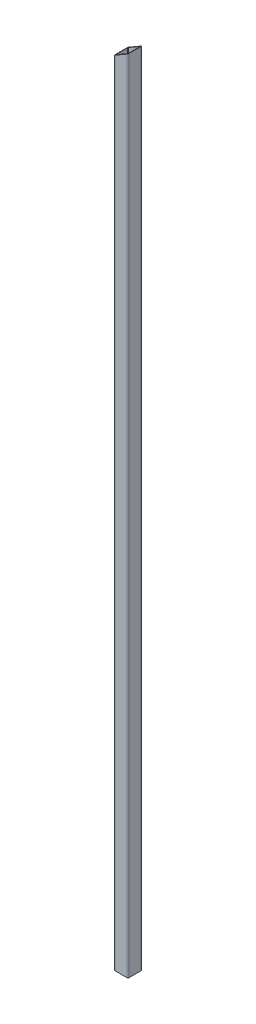
ISO-10303-21;
HEADER;
FILE_DESCRIPTION(('STEP AP214'),'2;1');
FILE_NAME('part.step','',(''),(''),'','','');
FILE_SCHEMA(('AUTOMOTIVE_DESIGN { 1 0 10303 214 1 1 1 1 }'));
ENDSEC;
DATA;
#1=APPLICATION_CONTEXT('core data for automotive mechanical design processes');
#2=APPLICATION_PROTOCOL_DEFINITION('international standard','automotive_design',2000,#1);
#3=PRODUCT_CONTEXT('',#1,'mechanical');
#4=PRODUCT('Part','Part','',(#3));
#5=PRODUCT_RELATED_PRODUCT_CATEGORY('part','',(#4));
#6=PRODUCT_DEFINITION_FORMATION('','',#4);
#7=PRODUCT_DEFINITION_CONTEXT('part definition',#1,'design');
#8=PRODUCT_DEFINITION('design','',#6,#7);
#9=PRODUCT_DEFINITION_SHAPE('','',#8);
#10=(LENGTH_UNIT() NAMED_UNIT(*) SI_UNIT(.MILLI.,.METRE.));
#11=(NAMED_UNIT(*) PLANE_ANGLE_UNIT() SI_UNIT($,.RADIAN.));
#12=(NAMED_UNIT(*) SI_UNIT($,.STERADIAN.) SOLID_ANGLE_UNIT());
#13=UNCERTAINTY_MEASURE_WITH_UNIT(LENGTH_MEASURE(1.E-05),#10,'distance_accuracy_value','');
#14=(GEOMETRIC_REPRESENTATION_CONTEXT(3) GLOBAL_UNCERTAINTY_ASSIGNED_CONTEXT((#13)) GLOBAL_UNIT_ASSIGNED_CONTEXT((#10,
#11,#12)) REPRESENTATION_CONTEXT('',''));
#15=CARTESIAN_POINT('',(0.,0.,0.));
#16=DIRECTION('',(0.,0.,1.));
#17=DIRECTION('',(1.,0.,0.));
#18=AXIS2_PLACEMENT_3D('',#15,#16,#17);
#19=CARTESIAN_POINT('',(-22.,-150.,22.));
#20=DIRECTION('',(0.,1.,0.));
#21=DIRECTION('',(0.,0.,1.));
#22=AXIS2_PLACEMENT_3D('',#19,#20,#21);
#23=CYLINDRICAL_SURFACE('',#22,3.);
#24=DIRECTION('',(0.,1.,0.));
#25=VECTOR('',#24,1.);
#26=CARTESIAN_POINT('',(-22.,-150.,25.));
#27=LINE('',#26,#25);
#28=CARTESIAN_POINT('',(-22.,-150.,25.));
#29=VERTEX_POINT('',#28);
#30=CARTESIAN_POINT('',(-22.,2678.15709287832,25.));
#31=VERTEX_POINT('',#30);
#32=EDGE_CURVE('E38',#29,#31,#27,.T.);
#33=ORIENTED_EDGE('',*,*,#32,.T.);
#34=CARTESIAN_POINT('',(-22.,2678.15709287832,22.));
#35=DIRECTION('',(0.5,-0.866025403784439,0.));
#36=DIRECTION('',(-0.866025403784439,-0.5,0.));
#37=AXIS2_PLACEMENT_3D('',#34,#35,#36);
#38=ELLIPSE('',#37,3.46410161513776,3.);
#39=CARTESIAN_POINT('',(-25.,2676.42504207075,22.));
#40=VERTEX_POINT('',#39);
#41=EDGE_CURVE('E167',#31,#40,#38,.T.);
#42=ORIENTED_EDGE('',*,*,#41,.T.);
#43=DIRECTION('',(0.,1.,0.));
#44=VECTOR('',#43,1.);
#45=CARTESIAN_POINT('',(-25.,-150.,22.));
#46=LINE('',#45,#44);
#47=CARTESIAN_POINT('',(-25.,-150.,22.));
#48=VERTEX_POINT('',#47);
#49=EDGE_CURVE('E11',#48,#40,#46,.T.);
#50=ORIENTED_EDGE('',*,*,#49,.F.);
#51=CARTESIAN_POINT('',(-22.,-150.,22.));
#52=DIRECTION('',(0.,1.,0.));
#53=DIRECTION('',(0.,0.,1.));
#54=AXIS2_PLACEMENT_3D('',#51,#52,#53);
#55=CIRCLE('',#54,3.);
#56=EDGE_CURVE('E234',#48,#29,#55,.T.);
#57=ORIENTED_EDGE('',*,*,#56,.T.);
#58=EDGE_LOOP('',(#33,#42,#50,#57));
#59=FACE_BOUND('',#58,.T.);
#60=ADVANCED_FACE('F35',(#59),#23,.T.);
#61=CARTESIAN_POINT('',(-25.,-150.,-22.));
#62=DIRECTION('',(-1.,0.,0.));
#63=DIRECTION('',(0.,0.,1.));
#64=AXIS2_PLACEMENT_3D('',#61,#62,#63);
#65=PLANE('',#64);
#66=ORIENTED_EDGE('',*,*,#49,.T.);
#67=DIRECTION('',(0.,0.,-1.));
#68=VECTOR('',#67,1.);
#69=CARTESIAN_POINT('',(-25.,2676.42504207075,-22.));
#70=LINE('',#69,#68);
#71=CARTESIAN_POINT('',(-25.,2676.42504207075,-22.));
#72=VERTEX_POINT('',#71);
#73=EDGE_CURVE('E184',#40,#72,#70,.T.);
#74=ORIENTED_EDGE('',*,*,#73,.T.);
#75=DIRECTION('',(0.,1.,0.));
#76=VECTOR('',#75,1.);
#77=CARTESIAN_POINT('',(-25.,-150.,-22.));
#78=LINE('',#77,#76);
#79=CARTESIAN_POINT('',(-25.,-150.,-22.));
#80=VERTEX_POINT('',#79);
#81=EDGE_CURVE('E43',#80,#72,#78,.T.);
#82=ORIENTED_EDGE('',*,*,#81,.F.);
#83=DIRECTION('',(0.,0.,1.));
#84=VECTOR('',#83,1.);
#85=CARTESIAN_POINT('',(-25.,-150.,-22.));
#86=LINE('',#85,#84);
#87=EDGE_CURVE('E264',#80,#48,#86,.T.);
#88=ORIENTED_EDGE('',*,*,#87,.T.);
#89=EDGE_LOOP('',(#66,#74,#82,#88));
#90=FACE_BOUND('',#89,.T.);
#91=ADVANCED_FACE('F293',(#90),#65,.T.);
#92=CARTESIAN_POINT('',(-22.,-150.,-22.));
#93=DIRECTION('',(0.,1.,0.));
#94=DIRECTION('',(0.,0.,1.));
#95=AXIS2_PLACEMENT_3D('',#92,#93,#94);
#96=CYLINDRICAL_SURFACE('',#95,3.);
#97=ORIENTED_EDGE('',*,*,#81,.T.);
#98=CARTESIAN_POINT('',(-22.,2678.15709287832,-22.));
#99=DIRECTION('',(0.5,-0.866025403784439,0.));
#100=DIRECTION('',(-0.866025403784439,-0.5,0.));
#101=AXIS2_PLACEMENT_3D('',#98,#99,#100);
#102=ELLIPSE('',#101,3.46410161513776,3.);
#103=CARTESIAN_POINT('',(-22.,2678.15709287832,-25.));
#104=VERTEX_POINT('',#103);
#105=EDGE_CURVE('E181',#72,#104,#102,.T.);
#106=ORIENTED_EDGE('',*,*,#105,.T.);
#107=DIRECTION('',(0.,1.,0.));
#108=VECTOR('',#107,1.);
#109=CARTESIAN_POINT('',(-22.,-150.,-25.));
#110=LINE('',#109,#108);
#111=CARTESIAN_POINT('',(-22.,-150.,-25.));
#112=VERTEX_POINT('',#111);
#113=EDGE_CURVE('E268',#112,#104,#110,.T.);
#114=ORIENTED_EDGE('',*,*,#113,.F.);
#115=CARTESIAN_POINT('',(-22.,-150.,-22.));
#116=DIRECTION('',(0.,1.,0.));
#117=DIRECTION('',(0.,0.,1.));
#118=AXIS2_PLACEMENT_3D('',#115,#116,#117);
#119=CIRCLE('',#118,3.);
#120=EDGE_CURVE('E261',#112,#80,#119,.T.);
#121=ORIENTED_EDGE('',*,*,#120,.T.);
#122=EDGE_LOOP('',(#97,#106,#114,#121));
#123=FACE_BOUND('',#122,.T.);
#124=ADVANCED_FACE('F290',(#123),#96,.T.);
#125=CARTESIAN_POINT('',(-22.,-150.,-25.));
#126=DIRECTION('',(0.,0.,-1.));
#127=DIRECTION('',(-1.,0.,0.));
#128=AXIS2_PLACEMENT_3D('',#125,#126,#127);
#129=PLANE('',#128);
#130=ORIENTED_EDGE('',*,*,#113,.T.);
#131=DIRECTION('',(0.866025403784439,0.5,0.));
#132=VECTOR('',#131,1.);
#133=CARTESIAN_POINT('',(16.4869804220583,2700.37756138529,-25.));
#134=LINE('',#133,#132);
#135=CARTESIAN_POINT('',(22.,2703.56050472266,-25.));
#136=VERTEX_POINT('',#135);
#137=EDGE_CURVE('E178',#104,#136,#134,.T.);
#138=ORIENTED_EDGE('',*,*,#137,.T.);
#139=DIRECTION('',(0.,1.,0.));
#140=VECTOR('',#139,1.);
#141=CARTESIAN_POINT('',(22.,-150.,-25.));
#142=LINE('',#141,#140);
#143=CARTESIAN_POINT('',(22.,-150.,-25.));
#144=VERTEX_POINT('',#143);
#145=EDGE_CURVE('E270',#144,#136,#142,.T.);
#146=ORIENTED_EDGE('',*,*,#145,.F.);
#147=DIRECTION('',(-1.,0.,0.));
#148=VECTOR('',#147,1.);
#149=CARTESIAN_POINT('',(-22.,-150.,-25.));
#150=LINE('',#149,#148);
#151=EDGE_CURVE('E258',#144,#112,#150,.T.);
#152=ORIENTED_EDGE('',*,*,#151,.T.);
#153=EDGE_LOOP('',(#130,#138,#146,#152));
#154=FACE_BOUND('',#153,.T.);
#155=ADVANCED_FACE('F284',(#154),#129,.T.);
#156=CARTESIAN_POINT('',(22.,-150.,-22.));
#157=DIRECTION('',(0.,1.,0.));
#158=DIRECTION('',(0.,0.,1.));
#159=AXIS2_PLACEMENT_3D('',#156,#157,#158);
#160=CYLINDRICAL_SURFACE('',#159,3.00000000000001);
#161=ORIENTED_EDGE('',*,*,#145,.T.);
#162=CARTESIAN_POINT('',(22.,2703.56050472266,-22.));
#163=DIRECTION('',(0.5,-0.866025403784439,0.));
#164=DIRECTION('',(-0.866025403784439,-0.5,0.));
#165=AXIS2_PLACEMENT_3D('',#162,#163,#164);
#166=ELLIPSE('',#165,3.46410161513776,3.00000000000001);
#167=CARTESIAN_POINT('',(25.,2705.29255553023,-22.));
#168=VERTEX_POINT('',#167);
#169=EDGE_CURVE('E172',#136,#168,#166,.T.);
#170=ORIENTED_EDGE('',*,*,#169,.T.);
#171=DIRECTION('',(0.,1.,0.));
#172=VECTOR('',#171,1.);
#173=CARTESIAN_POINT('',(25.,-150.,-22.));
#174=LINE('',#173,#172);
#175=CARTESIAN_POINT('',(25.,-150.,-22.));
#176=VERTEX_POINT('',#175);
#177=EDGE_CURVE('E272',#176,#168,#174,.T.);
#178=ORIENTED_EDGE('',*,*,#177,.F.);
#179=CARTESIAN_POINT('',(22.,-150.,-22.));
#180=DIRECTION('',(0.,1.,0.));
#181=DIRECTION('',(0.,0.,-1.));
#182=AXIS2_PLACEMENT_3D('',#179,#180,#181);
#183=CIRCLE('',#182,3.00000000000001);
#184=EDGE_CURVE('E255',#176,#144,#183,.T.);
#185=ORIENTED_EDGE('',*,*,#184,.T.);
#186=EDGE_LOOP('',(#161,#170,#178,#185));
#187=FACE_BOUND('',#186,.T.);
#188=ADVANCED_FACE('F281',(#187),#160,.T.);
#189=CARTESIAN_POINT('',(25.,-150.,-22.));
#190=DIRECTION('',(1.,0.,0.));
#191=DIRECTION('',(0.,0.,-1.));
#192=AXIS2_PLACEMENT_3D('',#189,#190,#191);
#193=PLANE('',#192);
#194=ORIENTED_EDGE('',*,*,#177,.T.);
#195=DIRECTION('',(0.,0.,1.));
#196=VECTOR('',#195,1.);
#197=CARTESIAN_POINT('',(25.,2705.29255553023,-22.));
#198=LINE('',#197,#196);
#199=CARTESIAN_POINT('',(25.,2705.29255553023,22.));
#200=VERTEX_POINT('',#199);
#201=EDGE_CURVE('E170',#168,#200,#198,.T.);
#202=ORIENTED_EDGE('',*,*,#201,.T.);
#203=DIRECTION('',(0.,1.,0.));
#204=VECTOR('',#203,1.);
#205=CARTESIAN_POINT('',(25.,-150.,22.));
#206=LINE('',#205,#204);
#207=CARTESIAN_POINT('',(25.,-150.,22.));
#208=VERTEX_POINT('',#207);
#209=EDGE_CURVE('E158',#208,#200,#206,.T.);
#210=ORIENTED_EDGE('',*,*,#209,.F.);
#211=DIRECTION('',(0.,0.,-1.));
#212=VECTOR('',#211,1.);
#213=CARTESIAN_POINT('',(25.,-150.,-22.));
#214=LINE('',#213,#212);
#215=EDGE_CURVE('E252',#208,#176,#214,.T.);
#216=ORIENTED_EDGE('',*,*,#215,.T.);
#217=EDGE_LOOP('',(#194,#202,#210,#216));
#218=FACE_BOUND('',#217,.T.);
#219=ADVANCED_FACE('F275',(#218),#193,.T.);
#220=CARTESIAN_POINT('',(22.,-150.,22.));
#221=DIRECTION('',(0.,1.,0.));
#222=DIRECTION('',(0.,0.,1.));
#223=AXIS2_PLACEMENT_3D('',#220,#221,#222);
#224=CYLINDRICAL_SURFACE('',#223,3.);
#225=ORIENTED_EDGE('',*,*,#209,.T.);
#226=CARTESIAN_POINT('',(22.,2703.56050472266,22.));
#227=DIRECTION('',(0.5,-0.866025403784439,0.));
#228=DIRECTION('',(-0.866025403784439,-0.5,0.));
#229=AXIS2_PLACEMENT_3D('',#226,#227,#228);
#230=ELLIPSE('',#229,3.46410161513775,3.);
#231=CARTESIAN_POINT('',(22.,2703.56050472266,25.));
#232=VERTEX_POINT('',#231);
#233=EDGE_CURVE('E164',#200,#232,#230,.T.);
#234=ORIENTED_EDGE('',*,*,#233,.T.);
#235=DIRECTION('',(0.,1.,0.));
#236=VECTOR('',#235,1.);
#237=CARTESIAN_POINT('',(22.,-150.,25.));
#238=LINE('',#237,#236);
#239=CARTESIAN_POINT('',(22.,-150.,25.));
#240=VERTEX_POINT('',#239);
#241=EDGE_CURVE('E148',#240,#232,#238,.T.);
#242=ORIENTED_EDGE('',*,*,#241,.F.);
#243=CARTESIAN_POINT('',(22.,-150.,22.));
#244=DIRECTION('',(0.,1.,0.));
#245=DIRECTION('',(0.,0.,1.));
#246=AXIS2_PLACEMENT_3D('',#243,#244,#245);
#247=CIRCLE('',#246,3.);
#248=EDGE_CURVE('E250',#240,#208,#247,.T.);
#249=ORIENTED_EDGE('',*,*,#248,.T.);
#250=EDGE_LOOP('',(#225,#234,#242,#249));
#251=FACE_BOUND('',#250,.T.);
#252=ADVANCED_FACE('F169',(#251),#224,.T.);
#253=CARTESIAN_POINT('',(-22.,-150.,25.));
#254=DIRECTION('',(0.,0.,1.));
#255=DIRECTION('',(1.,0.,0.));
#256=AXIS2_PLACEMENT_3D('',#253,#254,#255);
#257=PLANE('',#256);
#258=ORIENTED_EDGE('',*,*,#241,.T.);
#259=DIRECTION('',(-0.866025403784439,-0.5,0.));
#260=VECTOR('',#259,1.);
#261=CARTESIAN_POINT('',(16.4869804220583,2700.37756138529,25.));
#262=LINE('',#261,#260);
#263=EDGE_CURVE('E151',#232,#31,#262,.T.);
#264=ORIENTED_EDGE('',*,*,#263,.T.);
#265=ORIENTED_EDGE('',*,*,#32,.F.);
#266=DIRECTION('',(1.,0.,0.));
#267=VECTOR('',#266,1.);
#268=CARTESIAN_POINT('',(-22.,-150.,25.));
#269=LINE('',#268,#267);
#270=EDGE_CURVE('E153',#29,#240,#269,.T.);
#271=ORIENTED_EDGE('',*,*,#270,.T.);
#272=EDGE_LOOP('',(#258,#264,#265,#271));
#273=FACE_BOUND('',#272,.T.);
#274=ADVANCED_FACE('F150',(#273),#257,.T.);
#275=CARTESIAN_POINT('',(-22.,-150.,22.));
#276=DIRECTION('',(0.,1.,0.));
#277=DIRECTION('',(0.,0.,1.));
#278=AXIS2_PLACEMENT_3D('',#275,#276,#277);
#279=PLANE('',#278);
#280=DIRECTION('',(0.,0.,1.));
#281=VECTOR('',#280,1.);
#282=CARTESIAN_POINT('',(-22.,-150.,-20.));
#283=LINE('',#282,#281);
#284=CARTESIAN_POINT('',(-22.,-150.,-20.));
#285=VERTEX_POINT('',#284);
#286=CARTESIAN_POINT('',(-22.,-150.,20.));
#287=VERTEX_POINT('',#286);
#288=EDGE_CURVE('E228',#285,#287,#283,.T.);
#289=ORIENTED_EDGE('',*,*,#288,.T.);
#290=CARTESIAN_POINT('',(-20.,-150.,20.));
#291=DIRECTION('',(0.,1.,0.));
#292=DIRECTION('',(0.,0.,1.));
#293=AXIS2_PLACEMENT_3D('',#290,#291,#292);
#294=CIRCLE('',#293,2.);
#295=CARTESIAN_POINT('',(-20.,-150.,22.));
#296=VERTEX_POINT('',#295);
#297=EDGE_CURVE('E194',#287,#296,#294,.T.);
#298=ORIENTED_EDGE('',*,*,#297,.T.);
#299=DIRECTION('',(1.,0.,0.));
#300=VECTOR('',#299,1.);
#301=CARTESIAN_POINT('',(-20.,-150.,22.));
#302=LINE('',#301,#300);
#303=CARTESIAN_POINT('',(20.,-150.,22.));
#304=VERTEX_POINT('',#303);
#305=EDGE_CURVE('E212',#296,#304,#302,.T.);
#306=ORIENTED_EDGE('',*,*,#305,.T.);
#307=CARTESIAN_POINT('',(20.,-150.,20.));
#308=DIRECTION('',(0.,1.,0.));
#309=DIRECTION('',(0.,0.,1.));
#310=AXIS2_PLACEMENT_3D('',#307,#308,#309);
#311=CIRCLE('',#310,2.);
#312=CARTESIAN_POINT('',(22.,-150.,20.));
#313=VERTEX_POINT('',#312);
#314=EDGE_CURVE('E51',#304,#313,#311,.T.);
#315=ORIENTED_EDGE('',*,*,#314,.T.);
#316=DIRECTION('',(0.,0.,-1.));
#317=VECTOR('',#316,1.);
#318=CARTESIAN_POINT('',(22.,-150.,-20.));
#319=LINE('',#318,#317);
#320=CARTESIAN_POINT('',(22.,-150.,-20.));
#321=VERTEX_POINT('',#320);
#322=EDGE_CURVE('E216',#313,#321,#319,.T.);
#323=ORIENTED_EDGE('',*,*,#322,.T.);
#324=CARTESIAN_POINT('',(20.,-150.,-20.));
#325=DIRECTION('',(0.,1.,0.));
#326=DIRECTION('',(0.,0.,-1.));
#327=AXIS2_PLACEMENT_3D('',#324,#325,#326);
#328=CIRCLE('',#327,2.);
#329=CARTESIAN_POINT('',(20.,-150.,-22.));
#330=VERTEX_POINT('',#329);
#331=EDGE_CURVE('E219',#321,#330,#328,.T.);
#332=ORIENTED_EDGE('',*,*,#331,.T.);
#333=DIRECTION('',(-1.,0.,0.));
#334=VECTOR('',#333,1.);
#335=CARTESIAN_POINT('',(-20.,-150.,-22.));
#336=LINE('',#335,#334);
#337=CARTESIAN_POINT('',(-20.,-150.,-22.));
#338=VERTEX_POINT('',#337);
#339=EDGE_CURVE('E222',#330,#338,#336,.T.);
#340=ORIENTED_EDGE('',*,*,#339,.T.);
#341=CARTESIAN_POINT('',(-20.,-150.,-20.));
#342=DIRECTION('',(0.,1.,0.));
#343=DIRECTION('',(0.,0.,1.));
#344=AXIS2_PLACEMENT_3D('',#341,#342,#343);
#345=CIRCLE('',#344,2.);
#346=EDGE_CURVE('E225',#338,#285,#345,.T.);
#347=ORIENTED_EDGE('',*,*,#346,.T.);
#348=EDGE_LOOP('',(#289,#298,#306,#315,#323,#332,#340,#347));
#349=FACE_BOUND('',#348,.T.);
#350=ORIENTED_EDGE('',*,*,#56,.F.);
#351=ORIENTED_EDGE('',*,*,#87,.F.);
#352=ORIENTED_EDGE('',*,*,#120,.F.);
#353=ORIENTED_EDGE('',*,*,#151,.F.);
#354=ORIENTED_EDGE('',*,*,#184,.F.);
#355=ORIENTED_EDGE('',*,*,#215,.F.);
#356=ORIENTED_EDGE('',*,*,#248,.F.);
#357=ORIENTED_EDGE('',*,*,#270,.F.);
#358=EDGE_LOOP('',(#350,#351,#352,#353,#354,#355,#356,#357));
#359=FACE_BOUND('',#358,.T.);
#360=ADVANCED_FACE('F287',(#349,#359),#279,.F.);
#361=CARTESIAN_POINT('',(-20.,-150.,20.));
#362=DIRECTION('',(0.,1.,0.));
#363=DIRECTION('',(0.,0.,1.));
#364=AXIS2_PLACEMENT_3D('',#361,#362,#363);
#365=CYLINDRICAL_SURFACE('',#364,2.);
#366=DIRECTION('',(0.,1.,0.));
#367=VECTOR('',#366,1.);
#368=CARTESIAN_POINT('',(-22.,-150.,20.));
#369=LINE('',#368,#367);
#370=CARTESIAN_POINT('',(-22.,2678.15709287832,20.));
#371=VERTEX_POINT('',#370);
#372=EDGE_CURVE('E232',#287,#371,#369,.T.);
#373=ORIENTED_EDGE('',*,*,#372,.T.);
#374=CARTESIAN_POINT('',(-20.,2679.3117934167,20.));
#375=DIRECTION('',(0.5,-0.866025403784439,0.));
#376=DIRECTION('',(-0.866025403784439,-0.5,0.));
#377=AXIS2_PLACEMENT_3D('',#374,#375,#376);
#378=ELLIPSE('',#377,2.30940107675851,2.);
#379=CARTESIAN_POINT('',(-20.,2679.3117934167,22.));
#380=VERTEX_POINT('',#379);
#381=EDGE_CURVE('E187',#380,#371,#378,.T.);
#382=ORIENTED_EDGE('',*,*,#381,.F.);
#383=DIRECTION('',(0.,1.,0.));
#384=VECTOR('',#383,1.);
#385=CARTESIAN_POINT('',(-20.,-150.,22.));
#386=LINE('',#385,#384);
#387=EDGE_CURVE('E231',#296,#380,#386,.T.);
#388=ORIENTED_EDGE('',*,*,#387,.F.);
#389=ORIENTED_EDGE('',*,*,#297,.F.);
#390=EDGE_LOOP('',(#373,#382,#388,#389));
#391=FACE_BOUND('',#390,.T.);
#392=ADVANCED_FACE('F315',(#391),#365,.F.);
#393=CARTESIAN_POINT('',(-22.,-150.,-20.));
#394=DIRECTION('',(-1.,0.,0.));
#395=DIRECTION('',(0.,0.,1.));
#396=AXIS2_PLACEMENT_3D('',#393,#394,#395);
#397=PLANE('',#396);
#398=DIRECTION('',(0.,1.,0.));
#399=VECTOR('',#398,1.);
#400=CARTESIAN_POINT('',(-22.,-150.,-20.));
#401=LINE('',#400,#399);
#402=CARTESIAN_POINT('',(-22.,2678.15709287832,-20.));
#403=VERTEX_POINT('',#402);
#404=EDGE_CURVE('E235',#285,#403,#401,.T.);
#405=ORIENTED_EDGE('',*,*,#404,.T.);
#406=DIRECTION('',(0.,0.,-1.));
#407=VECTOR('',#406,1.);
#408=CARTESIAN_POINT('',(-22.,2678.15709287832,-20.));
#409=LINE('',#408,#407);
#410=EDGE_CURVE('E190',#371,#403,#409,.T.);
#411=ORIENTED_EDGE('',*,*,#410,.F.);
#412=ORIENTED_EDGE('',*,*,#372,.F.);
#413=ORIENTED_EDGE('',*,*,#288,.F.);
#414=EDGE_LOOP('',(#405,#411,#412,#413));
#415=FACE_BOUND('',#414,.T.);
#416=ADVANCED_FACE('F320',(#415),#397,.F.);
#417=CARTESIAN_POINT('',(-20.,-150.,-20.));
#418=DIRECTION('',(0.,1.,0.));
#419=DIRECTION('',(0.,0.,1.));
#420=AXIS2_PLACEMENT_3D('',#417,#418,#419);
#421=CYLINDRICAL_SURFACE('',#420,2.);
#422=DIRECTION('',(0.,1.,0.));
#423=VECTOR('',#422,1.);
#424=CARTESIAN_POINT('',(-20.,-150.,-22.));
#425=LINE('',#424,#423);
#426=CARTESIAN_POINT('',(-20.,2679.3117934167,-22.));
#427=VERTEX_POINT('',#426);
#428=EDGE_CURVE('E237',#338,#427,#425,.T.);
#429=ORIENTED_EDGE('',*,*,#428,.T.);
#430=CARTESIAN_POINT('',(-20.,2679.3117934167,-20.));
#431=DIRECTION('',(0.5,-0.866025403784439,0.));
#432=DIRECTION('',(-0.866025403784439,-0.5,0.));
#433=AXIS2_PLACEMENT_3D('',#430,#431,#432);
#434=ELLIPSE('',#433,2.30940107675851,2.);
#435=EDGE_CURVE('E207',#403,#427,#434,.T.);
#436=ORIENTED_EDGE('',*,*,#435,.F.);
#437=ORIENTED_EDGE('',*,*,#404,.F.);
#438=ORIENTED_EDGE('',*,*,#346,.F.);
#439=EDGE_LOOP('',(#429,#436,#437,#438));
#440=FACE_BOUND('',#439,.T.);
#441=ADVANCED_FACE('F347',(#440),#421,.F.);
#442=CARTESIAN_POINT('',(-20.,-150.,-22.));
#443=DIRECTION('',(0.,0.,-1.));
#444=DIRECTION('',(-1.,0.,0.));
#445=AXIS2_PLACEMENT_3D('',#442,#443,#444);
#446=PLANE('',#445);
#447=DIRECTION('',(0.,1.,0.));
#448=VECTOR('',#447,1.);
#449=CARTESIAN_POINT('',(20.,-150.,-22.));
#450=LINE('',#449,#448);
#451=CARTESIAN_POINT('',(20.,2702.40580418428,-22.));
#452=VERTEX_POINT('',#451);
#453=EDGE_CURVE('E239',#330,#452,#450,.T.);
#454=ORIENTED_EDGE('',*,*,#453,.T.);
#455=DIRECTION('',(0.866025403784439,0.5,0.));
#456=VECTOR('',#455,1.);
#457=CARTESIAN_POINT('',(17.9869804220583,2701.24358678907,-22.));
#458=LINE('',#457,#456);
#459=EDGE_CURVE('E204',#427,#452,#458,.T.);
#460=ORIENTED_EDGE('',*,*,#459,.F.);
#461=ORIENTED_EDGE('',*,*,#428,.F.);
#462=ORIENTED_EDGE('',*,*,#339,.F.);
#463=EDGE_LOOP('',(#454,#460,#461,#462));
#464=FACE_BOUND('',#463,.T.);
#465=ADVANCED_FACE('F344',(#464),#446,.F.);
#466=CARTESIAN_POINT('',(20.,-150.,-20.));
#467=DIRECTION('',(0.,1.,0.));
#468=DIRECTION('',(0.,0.,1.));
#469=AXIS2_PLACEMENT_3D('',#466,#467,#468);
#470=CYLINDRICAL_SURFACE('',#469,2.);
#471=DIRECTION('',(0.,1.,0.));
#472=VECTOR('',#471,1.);
#473=CARTESIAN_POINT('',(22.,-150.,-20.));
#474=LINE('',#473,#472);
#475=CARTESIAN_POINT('',(22.,2703.56050472266,-20.));
#476=VERTEX_POINT('',#475);
#477=EDGE_CURVE('E241',#321,#476,#474,.T.);
#478=ORIENTED_EDGE('',*,*,#477,.T.);
#479=CARTESIAN_POINT('',(20.,2702.40580418428,-20.));
#480=DIRECTION('',(0.5,-0.866025403784439,0.));
#481=DIRECTION('',(-0.866025403784439,-0.5,0.));
#482=AXIS2_PLACEMENT_3D('',#479,#480,#481);
#483=ELLIPSE('',#482,2.30940107675851,2.);
#484=EDGE_CURVE('E201',#452,#476,#483,.T.);
#485=ORIENTED_EDGE('',*,*,#484,.F.);
#486=ORIENTED_EDGE('',*,*,#453,.F.);
#487=ORIENTED_EDGE('',*,*,#331,.F.);
#488=EDGE_LOOP('',(#478,#485,#486,#487));
#489=FACE_BOUND('',#488,.T.);
#490=ADVANCED_FACE('F340',(#489),#470,.F.);
#491=CARTESIAN_POINT('',(22.,-150.,-20.));
#492=DIRECTION('',(1.,0.,0.));
#493=DIRECTION('',(0.,0.,-1.));
#494=AXIS2_PLACEMENT_3D('',#491,#492,#493);
#495=PLANE('',#494);
#496=DIRECTION('',(0.,1.,0.));
#497=VECTOR('',#496,1.);
#498=CARTESIAN_POINT('',(22.,-150.,20.));
#499=LINE('',#498,#497);
#500=CARTESIAN_POINT('',(22.,2703.56050472266,20.));
#501=VERTEX_POINT('',#500);
#502=EDGE_CURVE('E243',#313,#501,#499,.T.);
#503=ORIENTED_EDGE('',*,*,#502,.T.);
#504=DIRECTION('',(0.,0.,1.));
#505=VECTOR('',#504,1.);
#506=CARTESIAN_POINT('',(22.,2703.56050472266,-20.));
#507=LINE('',#506,#505);
#508=EDGE_CURVE('E198',#476,#501,#507,.T.);
#509=ORIENTED_EDGE('',*,*,#508,.F.);
#510=ORIENTED_EDGE('',*,*,#477,.F.);
#511=ORIENTED_EDGE('',*,*,#322,.F.);
#512=EDGE_LOOP('',(#503,#509,#510,#511));
#513=FACE_BOUND('',#512,.T.);
#514=ADVANCED_FACE('F336',(#513),#495,.F.);
#515=CARTESIAN_POINT('',(20.,-150.,20.));
#516=DIRECTION('',(0.,1.,0.));
#517=DIRECTION('',(0.,0.,1.));
#518=AXIS2_PLACEMENT_3D('',#515,#516,#517);
#519=CYLINDRICAL_SURFACE('',#518,2.);
#520=DIRECTION('',(0.,1.,0.));
#521=VECTOR('',#520,1.);
#522=CARTESIAN_POINT('',(20.,-150.,22.));
#523=LINE('',#522,#521);
#524=CARTESIAN_POINT('',(20.,2702.40580418428,22.));
#525=VERTEX_POINT('',#524);
#526=EDGE_CURVE('E245',#304,#525,#523,.T.);
#527=ORIENTED_EDGE('',*,*,#526,.T.);
#528=CARTESIAN_POINT('',(20.,2702.40580418428,20.));
#529=DIRECTION('',(0.5,-0.866025403784439,0.));
#530=DIRECTION('',(-0.866025403784439,-0.5,0.));
#531=AXIS2_PLACEMENT_3D('',#528,#529,#530);
#532=ELLIPSE('',#531,2.30940107675851,2.);
#533=EDGE_CURVE('E195',#501,#525,#532,.T.);
#534=ORIENTED_EDGE('',*,*,#533,.F.);
#535=ORIENTED_EDGE('',*,*,#502,.F.);
#536=ORIENTED_EDGE('',*,*,#314,.F.);
#537=EDGE_LOOP('',(#527,#534,#535,#536));
#538=FACE_BOUND('',#537,.T.);
#539=ADVANCED_FACE('F351',(#538),#519,.F.);
#540=CARTESIAN_POINT('',(-20.,-150.,22.));
#541=DIRECTION('',(0.,0.,1.));
#542=DIRECTION('',(1.,0.,0.));
#543=AXIS2_PLACEMENT_3D('',#540,#541,#542);
#544=PLANE('',#543);
#545=ORIENTED_EDGE('',*,*,#387,.T.);
#546=DIRECTION('',(-0.866025403784439,-0.5,0.));
#547=VECTOR('',#546,1.);
#548=CARTESIAN_POINT('',(17.9869804220583,2701.24358678907,22.));
#549=LINE('',#548,#547);
#550=EDGE_CURVE('E191',#525,#380,#549,.T.);
#551=ORIENTED_EDGE('',*,*,#550,.F.);
#552=ORIENTED_EDGE('',*,*,#526,.F.);
#553=ORIENTED_EDGE('',*,*,#305,.F.);
#554=EDGE_LOOP('',(#545,#551,#552,#553));
#555=FACE_BOUND('',#554,.T.);
#556=ADVANCED_FACE('F332',(#555),#544,.F.);
#557=CARTESIAN_POINT('',(532.5,2998.29781714396,22.0000000000005));
#558=DIRECTION('',(0.5,-0.866025403784439,0.));
#559=DIRECTION('',(0.,0.,1.));
#560=AXIS2_PLACEMENT_3D('',#557,#558,#559);
#561=PLANE('',#560);
#562=ORIENTED_EDGE('',*,*,#381,.T.);
#563=ORIENTED_EDGE('',*,*,#410,.T.);
#564=ORIENTED_EDGE('',*,*,#435,.T.);
#565=ORIENTED_EDGE('',*,*,#459,.T.);
#566=ORIENTED_EDGE('',*,*,#484,.T.);
#567=ORIENTED_EDGE('',*,*,#508,.T.);
#568=ORIENTED_EDGE('',*,*,#533,.T.);
#569=ORIENTED_EDGE('',*,*,#550,.T.);
#570=EDGE_LOOP('',(#562,#563,#564,#565,#566,#567,#568,#569));
#571=FACE_BOUND('',#570,.T.);
#572=ORIENTED_EDGE('',*,*,#263,.F.);
#573=ORIENTED_EDGE('',*,*,#233,.F.);
#574=ORIENTED_EDGE('',*,*,#201,.F.);
#575=ORIENTED_EDGE('',*,*,#169,.F.);
#576=ORIENTED_EDGE('',*,*,#137,.F.);
#577=ORIENTED_EDGE('',*,*,#105,.F.);
#578=ORIENTED_EDGE('',*,*,#73,.F.);
#579=ORIENTED_EDGE('',*,*,#41,.F.);
#580=EDGE_LOOP('',(#572,#573,#574,#575,#576,#577,#578,#579));
#581=FACE_BOUND('',#580,.T.);
#582=ADVANCED_FACE('F162',(#571,#581),#561,.F.);
#583=CLOSED_SHELL('',(#60,#91,#124,#155,#188,#219,#252,#274,#360,#392,#416,#441,#465,#490,#514,
#539,#556,#582));
#584=MANIFOLD_SOLID_BREP('B2',#583);
#585=ADVANCED_BREP_SHAPE_REPRESENTATION('',(#18,#584),#14);
#586=SHAPE_DEFINITION_REPRESENTATION(#9,#585);
ENDSEC;
END-ISO-10303-21;
